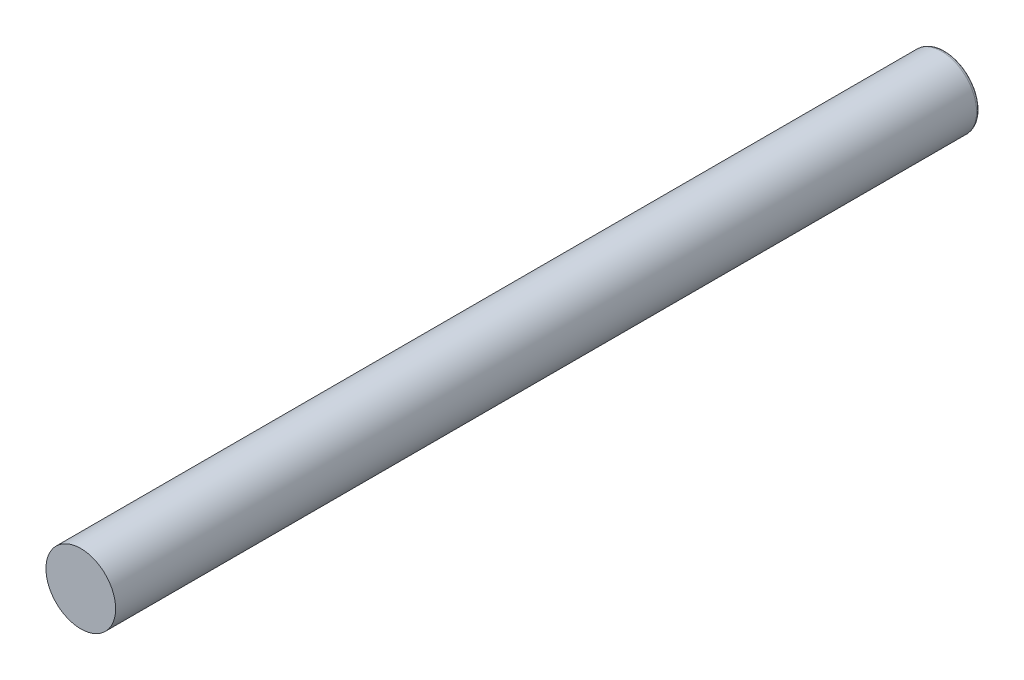
ISO-10303-21;
HEADER;
FILE_DESCRIPTION(('STEP AP214'),'2;1');
FILE_NAME('part.step','',(''),(''),'','','');
FILE_SCHEMA(('AUTOMOTIVE_DESIGN { 1 0 10303 214 1 1 1 1 }'));
ENDSEC;
DATA;
#1=APPLICATION_CONTEXT('core data for automotive mechanical design processes');
#2=APPLICATION_PROTOCOL_DEFINITION('international standard','automotive_design',2000,#1);
#3=PRODUCT_CONTEXT('',#1,'mechanical');
#4=PRODUCT('Part','Part','',(#3));
#5=PRODUCT_RELATED_PRODUCT_CATEGORY('part','',(#4));
#6=PRODUCT_DEFINITION_FORMATION('','',#4);
#7=PRODUCT_DEFINITION_CONTEXT('part definition',#1,'design');
#8=PRODUCT_DEFINITION('design','',#6,#7);
#9=PRODUCT_DEFINITION_SHAPE('','',#8);
#10=(LENGTH_UNIT() NAMED_UNIT(*) SI_UNIT(.MILLI.,.METRE.));
#11=(NAMED_UNIT(*) PLANE_ANGLE_UNIT() SI_UNIT($,.RADIAN.));
#12=(NAMED_UNIT(*) SI_UNIT($,.STERADIAN.) SOLID_ANGLE_UNIT());
#13=UNCERTAINTY_MEASURE_WITH_UNIT(LENGTH_MEASURE(1.E-05),#10,'distance_accuracy_value','');
#14=(GEOMETRIC_REPRESENTATION_CONTEXT(3) GLOBAL_UNCERTAINTY_ASSIGNED_CONTEXT((#13)) GLOBAL_UNIT_ASSIGNED_CONTEXT((#10,
#11,#12)) REPRESENTATION_CONTEXT('',''));
#15=CARTESIAN_POINT('',(0.,0.,0.));
#16=DIRECTION('',(0.,0.,1.));
#17=DIRECTION('',(1.,0.,0.));
#18=AXIS2_PLACEMENT_3D('',#15,#16,#17);
#19=CARTESIAN_POINT('',(0.,0.,-62.));
#20=DIRECTION('',(0.,0.,1.));
#21=DIRECTION('',(-1.,0.,0.));
#22=AXIS2_PLACEMENT_3D('',#19,#20,#21);
#23=CYLINDRICAL_SURFACE('',#22,2.5);
#24=CARTESIAN_POINT('',(0.,0.,-61.75));
#25=DIRECTION('',(0.,0.,1.));
#26=DIRECTION('',(1.,0.,0.));
#27=AXIS2_PLACEMENT_3D('',#24,#25,#26);
#28=CIRCLE('',#27,2.5);
#29=CARTESIAN_POINT('',(2.5,0.,-61.75));
#30=VERTEX_POINT('',#29);
#31=EDGE_CURVE('E42',#30,#30,#28,.F.);
#32=ORIENTED_EDGE('',*,*,#31,.F.);
#33=EDGE_LOOP('',(#32));
#34=FACE_BOUND('',#33,.T.);
#35=CARTESIAN_POINT('',(0.,0.,0.));
#36=DIRECTION('',(0.,0.,1.));
#37=DIRECTION('',(1.,0.,0.));
#38=AXIS2_PLACEMENT_3D('',#35,#36,#37);
#39=CIRCLE('',#38,2.5);
#40=CARTESIAN_POINT('',(2.5,0.,0.));
#41=VERTEX_POINT('',#40);
#42=EDGE_CURVE('E55',#41,#41,#39,.T.);
#43=ORIENTED_EDGE('',*,*,#42,.F.);
#44=EDGE_LOOP('',(#43));
#45=FACE_BOUND('',#44,.T.);
#46=ADVANCED_FACE('F35',(#34,#45),#23,.T.);
#47=CARTESIAN_POINT('',(0.,0.,-62.));
#48=DIRECTION('',(0.,0.,-1.));
#49=DIRECTION('',(1.,0.,0.));
#50=AXIS2_PLACEMENT_3D('',#47,#48,#49);
#51=PLANE('',#50);
#52=CARTESIAN_POINT('',(0.,0.,-62.));
#53=DIRECTION('',(0.,0.,1.));
#54=DIRECTION('',(1.,0.,0.));
#55=AXIS2_PLACEMENT_3D('',#52,#53,#54);
#56=CIRCLE('',#55,2.25);
#57=CARTESIAN_POINT('',(2.25,0.,-62.));
#58=VERTEX_POINT('',#57);
#59=EDGE_CURVE('E46',#58,#58,#56,.T.);
#60=ORIENTED_EDGE('',*,*,#59,.F.);
#61=EDGE_LOOP('',(#60));
#62=FACE_BOUND('',#61,.T.);
#63=CARTESIAN_POINT('',(0.,0.,-62.));
#64=DIRECTION('',(0.,0.,1.));
#65=DIRECTION('',(1.,0.,0.));
#66=AXIS2_PLACEMENT_3D('',#63,#64,#65);
#67=CIRCLE('',#66,1.25);
#68=CARTESIAN_POINT('',(1.25,0.,-62.));
#69=VERTEX_POINT('',#68);
#70=EDGE_CURVE('E50',#69,#69,#67,.F.);
#71=ORIENTED_EDGE('',*,*,#70,.F.);
#72=EDGE_LOOP('',(#71));
#73=FACE_BOUND('',#72,.T.);
#74=ADVANCED_FACE('F76',(#62,#73),#51,.T.);
#75=CARTESIAN_POINT('',(0.,0.,0.));
#76=DIRECTION('',(0.,0.,-1.));
#77=DIRECTION('',(1.,0.,0.));
#78=AXIS2_PLACEMENT_3D('',#75,#76,#77);
#79=PLANE('',#78);
#80=ORIENTED_EDGE('',*,*,#42,.T.);
#81=EDGE_LOOP('',(#80));
#82=FACE_BOUND('',#81,.T.);
#83=ADVANCED_FACE('F72',(#82),#79,.F.);
#84=CARTESIAN_POINT('',(0.,0.,-52.));
#85=DIRECTION('',(0.,0.,-1.));
#86=DIRECTION('',(1.,0.,0.));
#87=AXIS2_PLACEMENT_3D('',#84,#85,#86);
#88=CYLINDRICAL_SURFACE('',#87,1.);
#89=CARTESIAN_POINT('',(0.,0.,-61.75));
#90=DIRECTION('',(0.,0.,1.));
#91=DIRECTION('',(1.,0.,0.));
#92=AXIS2_PLACEMENT_3D('',#89,#90,#91);
#93=CIRCLE('',#92,1.);
#94=CARTESIAN_POINT('',(1.,0.,-61.75));
#95=VERTEX_POINT('',#94);
#96=EDGE_CURVE('E10',#95,#95,#93,.T.);
#97=ORIENTED_EDGE('',*,*,#96,.F.);
#98=EDGE_LOOP('',(#97));
#99=FACE_BOUND('',#98,.T.);
#100=CARTESIAN_POINT('',(0.,0.,-52.));
#101=DIRECTION('',(0.,0.,1.));
#102=DIRECTION('',(1.,0.,0.));
#103=AXIS2_PLACEMENT_3D('',#100,#101,#102);
#104=CIRCLE('',#103,1.);
#105=CARTESIAN_POINT('',(1.,0.,-52.));
#106=VERTEX_POINT('',#105);
#107=EDGE_CURVE('E58',#106,#106,#104,.T.);
#108=ORIENTED_EDGE('',*,*,#107,.T.);
#109=EDGE_LOOP('',(#108));
#110=FACE_BOUND('',#109,.T.);
#111=ADVANCED_FACE('F62',(#99,#110),#88,.F.);
#112=CARTESIAN_POINT('',(0.,0.,-52.));
#113=DIRECTION('',(0.,0.,-1.));
#114=DIRECTION('',(1.,0.,0.));
#115=AXIS2_PLACEMENT_3D('',#112,#113,#114);
#116=PLANE('',#115);
#117=ORIENTED_EDGE('',*,*,#107,.F.);
#118=EDGE_LOOP('',(#117));
#119=FACE_BOUND('',#118,.T.);
#120=ADVANCED_FACE('F64',(#119),#116,.T.);
#121=CARTESIAN_POINT('',(0.,0.,-61.75));
#122=DIRECTION('',(0.,0.,-1.));
#123=DIRECTION('',(1.,0.,0.));
#124=AXIS2_PLACEMENT_3D('',#121,#122,#123);
#125=TOROIDAL_SURFACE('',#124,2.25,0.25);
#126=ORIENTED_EDGE('',*,*,#31,.T.);
#127=EDGE_LOOP('',(#126));
#128=FACE_BOUND('',#127,.T.);
#129=ORIENTED_EDGE('',*,*,#59,.T.);
#130=EDGE_LOOP('',(#129));
#131=FACE_BOUND('',#130,.T.);
#132=ADVANCED_FACE('F66',(#128,#131),#125,.T.);
#133=CARTESIAN_POINT('',(0.,0.,-61.75));
#134=DIRECTION('',(0.,0.,-1.));
#135=DIRECTION('',(1.,0.,0.));
#136=AXIS2_PLACEMENT_3D('',#133,#134,#135);
#137=TOROIDAL_SURFACE('',#136,1.25,0.25);
#138=ORIENTED_EDGE('',*,*,#70,.T.);
#139=EDGE_LOOP('',(#138));
#140=FACE_BOUND('',#139,.T.);
#141=ORIENTED_EDGE('',*,*,#96,.T.);
#142=EDGE_LOOP('',(#141));
#143=FACE_BOUND('',#142,.T.);
#144=ADVANCED_FACE('F37',(#140,#143),#137,.T.);
#145=CLOSED_SHELL('',(#46,#74,#83,#111,#120,#132,#144));
#146=MANIFOLD_SOLID_BREP('B2',#145);
#147=ADVANCED_BREP_SHAPE_REPRESENTATION('',(#18,#146),#14);
#148=SHAPE_DEFINITION_REPRESENTATION(#9,#147);
ENDSEC;
END-ISO-10303-21;
